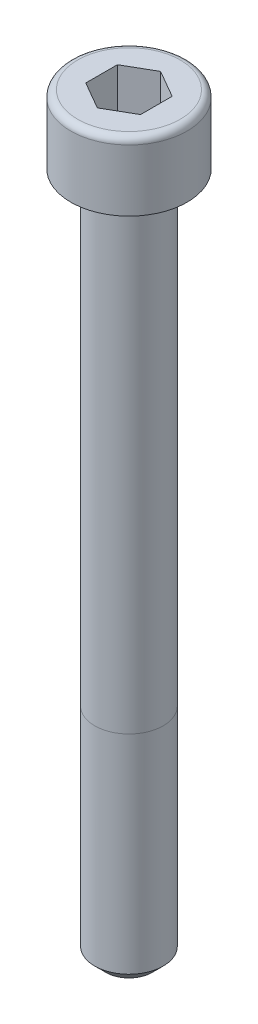
ISO-10303-21;
HEADER;
FILE_DESCRIPTION(('STEP AP214'),'2;1');
FILE_NAME('part.step','',(''),(''),'','','');
FILE_SCHEMA(('AUTOMOTIVE_DESIGN { 1 0 10303 214 1 1 1 1 }'));
ENDSEC;
DATA;
#1=APPLICATION_CONTEXT('core data for automotive mechanical design processes');
#2=APPLICATION_PROTOCOL_DEFINITION('international standard','automotive_design',2000,#1);
#3=PRODUCT_CONTEXT('',#1,'mechanical');
#4=PRODUCT('Part','Part','',(#3));
#5=PRODUCT_RELATED_PRODUCT_CATEGORY('part','',(#4));
#6=PRODUCT_DEFINITION_FORMATION('','',#4);
#7=PRODUCT_DEFINITION_CONTEXT('part definition',#1,'design');
#8=PRODUCT_DEFINITION('design','',#6,#7);
#9=PRODUCT_DEFINITION_SHAPE('','',#8);
#10=(LENGTH_UNIT() NAMED_UNIT(*) SI_UNIT(.MILLI.,.METRE.));
#11=(NAMED_UNIT(*) PLANE_ANGLE_UNIT() SI_UNIT($,.RADIAN.));
#12=(NAMED_UNIT(*) SI_UNIT($,.STERADIAN.) SOLID_ANGLE_UNIT());
#13=UNCERTAINTY_MEASURE_WITH_UNIT(LENGTH_MEASURE(1.E-05),#10,'distance_accuracy_value','');
#14=(GEOMETRIC_REPRESENTATION_CONTEXT(3) GLOBAL_UNCERTAINTY_ASSIGNED_CONTEXT((#13)) GLOBAL_UNIT_ASSIGNED_CONTEXT((#10,
#11,#12)) REPRESENTATION_CONTEXT('',''));
#15=CARTESIAN_POINT('',(0.,0.,0.));
#16=DIRECTION('',(0.,0.,1.));
#17=DIRECTION('',(1.,0.,0.));
#18=AXIS2_PLACEMENT_3D('',#15,#16,#17);
#19=CARTESIAN_POINT('',(0.,65.1172922252011,0.));
#20=DIRECTION('',(0.,1.,0.));
#21=DIRECTION('',(-1.,0.,0.));
#22=AXIS2_PLACEMENT_3D('',#19,#20,#21);
#23=CYLINDRICAL_SURFACE('',#22,2.49999999999999);
#24=CARTESIAN_POINT('',(0.,-54.2,0.));
#25=DIRECTION('',(0.,1.,0.));
#26=DIRECTION('',(-1.,0.,0.));
#27=AXIS2_PLACEMENT_3D('',#24,#25,#26);
#28=CIRCLE('',#27,2.5);
#29=CARTESIAN_POINT('',(-2.49999999999998,-54.2,0.));
#30=VERTEX_POINT('',#29);
#31=EDGE_CURVE('E470',#30,#30,#28,.T.);
#32=ORIENTED_EDGE('',*,*,#31,.T.);
#33=EDGE_LOOP('',(#32));
#34=FACE_BOUND('',#33,.T.);
#35=CARTESIAN_POINT('',(0.,-39.,0.));
#36=DIRECTION('',(0.,1.,0.));
#37=DIRECTION('',(0.,0.,1.));
#38=AXIS2_PLACEMENT_3D('',#35,#36,#37);
#39=CIRCLE('',#38,2.49999999999999);
#40=CARTESIAN_POINT('',(0.,-39.,2.49999999999999));
#41=VERTEX_POINT('',#40);
#42=EDGE_CURVE('E11',#41,#41,#39,.T.);
#43=ORIENTED_EDGE('',*,*,#42,.F.);
#44=EDGE_LOOP('',(#43));
#45=FACE_BOUND('',#44,.T.);
#46=ADVANCED_FACE('F350',(#34,#45),#23,.T.);
#47=CARTESIAN_POINT('',(1.70000000000001,-55.,0.));
#48=DIRECTION('',(0.,-1.,0.));
#49=DIRECTION('',(1.,0.,0.));
#50=AXIS2_PLACEMENT_3D('',#47,#48,#49);
#51=PLANE('',#50);
#52=CARTESIAN_POINT('',(0.,-55.,0.));
#53=DIRECTION('',(0.,1.,0.));
#54=DIRECTION('',(-1.,0.,0.));
#55=AXIS2_PLACEMENT_3D('',#52,#53,#54);
#56=CIRCLE('',#55,1.7);
#57=CARTESIAN_POINT('',(-1.69999999999999,-55.,0.));
#58=VERTEX_POINT('',#57);
#59=EDGE_CURVE('E359',#58,#58,#56,.T.);
#60=ORIENTED_EDGE('',*,*,#59,.F.);
#61=EDGE_LOOP('',(#60));
#62=FACE_BOUND('',#61,.T.);
#63=ADVANCED_FACE('F352',(#62),#51,.T.);
#64=CARTESIAN_POINT('',(0.,-55.,0.));
#65=DIRECTION('',(0.,1.,0.));
#66=DIRECTION('',(-1.,0.,0.));
#67=AXIS2_PLACEMENT_3D('',#64,#65,#66);
#68=CONICAL_SURFACE('',#67,1.7,0.78539816339746);
#69=ORIENTED_EDGE('',*,*,#31,.F.);
#70=EDGE_LOOP('',(#69));
#71=FACE_BOUND('',#70,.T.);
#72=ORIENTED_EDGE('',*,*,#59,.T.);
#73=EDGE_LOOP('',(#72));
#74=FACE_BOUND('',#73,.T.);
#75=ADVANCED_FACE('F475',(#71,#74),#68,.T.);
#76=ORIENTED_EDGE('',*,*,#42,.T.);
#77=EDGE_LOOP('',(#76));
#78=FACE_BOUND('',#77,.T.);
#79=CARTESIAN_POINT('',(0.,-5.,0.));
#80=DIRECTION('',(0.,1.,0.));
#81=DIRECTION('',(-1.,0.,0.));
#82=AXIS2_PLACEMENT_3D('',#79,#80,#81);
#83=CIRCLE('',#82,2.49999999999998);
#84=CARTESIAN_POINT('',(-2.49999999999997,-5.,0.));
#85=VERTEX_POINT('',#84);
#86=EDGE_CURVE('E467',#85,#85,#83,.T.);
#87=ORIENTED_EDGE('',*,*,#86,.F.);
#88=EDGE_LOOP('',(#87));
#89=FACE_BOUND('',#88,.T.);
#90=ADVANCED_FACE('F481',(#78,#89),#23,.T.);
#91=CARTESIAN_POINT('',(2.49999999999999,-5.,0.));
#92=DIRECTION('',(0.,1.,0.));
#93=DIRECTION('',(-1.,0.,0.));
#94=AXIS2_PLACEMENT_3D('',#91,#92,#93);
#95=PLANE('',#94);
#96=CARTESIAN_POINT('',(0.,-5.,0.));
#97=DIRECTION('',(0.,1.,0.));
#98=DIRECTION('',(-1.,0.,0.));
#99=AXIS2_PLACEMENT_3D('',#96,#97,#98);
#100=CIRCLE('',#99,4.24999999999998);
#101=CARTESIAN_POINT('',(-4.24999999999997,-5.00000000000001,0.));
#102=VERTEX_POINT('',#101);
#103=EDGE_CURVE('E464',#102,#102,#100,.T.);
#104=ORIENTED_EDGE('',*,*,#103,.F.);
#105=EDGE_LOOP('',(#104));
#106=FACE_BOUND('',#105,.T.);
#107=ORIENTED_EDGE('',*,*,#86,.T.);
#108=EDGE_LOOP('',(#107));
#109=FACE_BOUND('',#108,.T.);
#110=ADVANCED_FACE('F492',(#106,#109),#95,.F.);
#111=CARTESIAN_POINT('',(0.,65.1172922252011,0.));
#112=DIRECTION('',(0.,1.,0.));
#113=DIRECTION('',(-1.,0.,0.));
#114=AXIS2_PLACEMENT_3D('',#111,#112,#113);
#115=CYLINDRICAL_SURFACE('',#114,4.24999999999998);
#116=CARTESIAN_POINT('',(0.,-0.5,0.));
#117=DIRECTION('',(0.,1.,0.));
#118=DIRECTION('',(-1.,0.,0.));
#119=AXIS2_PLACEMENT_3D('',#116,#117,#118);
#120=CIRCLE('',#119,4.24999999999998);
#121=CARTESIAN_POINT('',(-4.24999999999998,-0.500000000000001,0.));
#122=VERTEX_POINT('',#121);
#123=EDGE_CURVE('E461',#122,#122,#120,.T.);
#124=ORIENTED_EDGE('',*,*,#123,.F.);
#125=EDGE_LOOP('',(#124));
#126=FACE_BOUND('',#125,.T.);
#127=ORIENTED_EDGE('',*,*,#103,.T.);
#128=EDGE_LOOP('',(#127));
#129=FACE_BOUND('',#128,.T.);
#130=ADVANCED_FACE('F497',(#126,#129),#115,.T.);
#131=CARTESIAN_POINT('',(0.,-0.5,0.));
#132=DIRECTION('',(0.,1.,0.));
#133=DIRECTION('',(-1.,0.,0.));
#134=AXIS2_PLACEMENT_3D('',#131,#132,#133);
#135=TOROIDAL_SURFACE('',#134,3.74999999999998,0.5);
#136=CARTESIAN_POINT('',(0.,0.,0.));
#137=DIRECTION('',(0.,1.,0.));
#138=DIRECTION('',(-1.,0.,0.));
#139=AXIS2_PLACEMENT_3D('',#136,#137,#138);
#140=CIRCLE('',#139,3.74999999999998);
#141=CARTESIAN_POINT('',(-3.74999999999998,0.,0.));
#142=VERTEX_POINT('',#141);
#143=EDGE_CURVE('E452',#142,#142,#140,.T.);
#144=ORIENTED_EDGE('',*,*,#143,.F.);
#145=EDGE_LOOP('',(#144));
#146=FACE_BOUND('',#145,.T.);
#147=ORIENTED_EDGE('',*,*,#123,.T.);
#148=EDGE_LOOP('',(#147));
#149=FACE_BOUND('',#148,.T.);
#150=ADVANCED_FACE('F506',(#146,#149),#135,.T.);
#151=CARTESIAN_POINT('',(3.74999999999999,0.,0.));
#152=DIRECTION('',(0.,-1.,0.));
#153=DIRECTION('',(1.,0.,0.));
#154=AXIS2_PLACEMENT_3D('',#151,#152,#153);
#155=PLANE('',#154);
#156=DIRECTION('',(0.,0.,1.));
#157=VECTOR('',#156,1.);
#158=CARTESIAN_POINT('',(-2.,0.,-1.15470053837925));
#159=LINE('',#158,#157);
#160=CARTESIAN_POINT('',(-2.,0.,-1.15470053837925));
#161=VERTEX_POINT('',#160);
#162=CARTESIAN_POINT('',(-2.,0.,1.15470053837925));
#163=VERTEX_POINT('',#162);
#164=EDGE_CURVE('E429',#161,#163,#159,.T.);
#165=ORIENTED_EDGE('',*,*,#164,.F.);
#166=DIRECTION('',(-0.866025403784439,0.,0.5));
#167=VECTOR('',#166,1.);
#168=CARTESIAN_POINT('',(0.,0.,-2.3094010767585));
#169=LINE('',#168,#167);
#170=CARTESIAN_POINT('',(0.,0.,-2.3094010767585));
#171=VERTEX_POINT('',#170);
#172=EDGE_CURVE('E366',#171,#161,#169,.T.);
#173=ORIENTED_EDGE('',*,*,#172,.F.);
#174=DIRECTION('',(0.866025403784439,0.,0.5));
#175=VECTOR('',#174,1.);
#176=CARTESIAN_POINT('',(0.,0.,-2.3094010767585));
#177=LINE('',#176,#175);
#178=CARTESIAN_POINT('',(2.,0.,-1.15470053837925));
#179=VERTEX_POINT('',#178);
#180=EDGE_CURVE('E580',#171,#179,#177,.T.);
#181=ORIENTED_EDGE('',*,*,#180,.T.);
#182=DIRECTION('',(0.,0.,1.));
#183=VECTOR('',#182,1.);
#184=CARTESIAN_POINT('',(2.,0.,-1.15470053837925));
#185=LINE('',#184,#183);
#186=CARTESIAN_POINT('',(2.,0.,1.15470053837925));
#187=VERTEX_POINT('',#186);
#188=EDGE_CURVE('E577',#179,#187,#185,.T.);
#189=ORIENTED_EDGE('',*,*,#188,.T.);
#190=DIRECTION('',(-0.866025403784439,0.,0.5));
#191=VECTOR('',#190,1.);
#192=CARTESIAN_POINT('',(2.,0.,1.15470053837925));
#193=LINE('',#192,#191);
#194=CARTESIAN_POINT('',(0.,0.,2.3094010767585));
#195=VERTEX_POINT('',#194);
#196=EDGE_CURVE('E574',#187,#195,#193,.T.);
#197=ORIENTED_EDGE('',*,*,#196,.T.);
#198=DIRECTION('',(0.866025403784439,0.,0.5));
#199=VECTOR('',#198,1.);
#200=CARTESIAN_POINT('',(-2.,0.,1.15470053837925));
#201=LINE('',#200,#199);
#202=EDGE_CURVE('E572',#163,#195,#201,.T.);
#203=ORIENTED_EDGE('',*,*,#202,.F.);
#204=EDGE_LOOP('',(#165,#173,#181,#189,#197,#203));
#205=FACE_BOUND('',#204,.T.);
#206=ORIENTED_EDGE('',*,*,#143,.T.);
#207=EDGE_LOOP('',(#206));
#208=FACE_BOUND('',#207,.T.);
#209=ADVANCED_FACE('F513',(#205,#208),#155,.F.);
#210=CARTESIAN_POINT('',(0.,-3.6,-2.3094010767585));
#211=DIRECTION('',(-0.5,0.,-0.866025403784439));
#212=DIRECTION('',(-0.866025403784439,0.,0.5));
#213=AXIS2_PLACEMENT_3D('',#210,#211,#212);
#214=PLANE('',#213);
#215=ORIENTED_EDGE('',*,*,#172,.T.);
#216=DIRECTION('',(0.,1.,0.));
#217=VECTOR('',#216,1.);
#218=CARTESIAN_POINT('',(-2.,-3.6,-1.15470053837925));
#219=LINE('',#218,#217);
#220=CARTESIAN_POINT('',(-2.,-3.6,-1.15470053837925));
#221=VERTEX_POINT('',#220);
#222=EDGE_CURVE('E434',#221,#161,#219,.T.);
#223=ORIENTED_EDGE('',*,*,#222,.F.);
#224=DIRECTION('',(-0.866025403784439,0.,0.5));
#225=VECTOR('',#224,1.);
#226=CARTESIAN_POINT('',(0.,-3.6,-2.3094010767585));
#227=LINE('',#226,#225);
#228=CARTESIAN_POINT('',(0.,-3.6,-2.3094010767585));
#229=VERTEX_POINT('',#228);
#230=EDGE_CURVE('E423',#229,#221,#227,.T.);
#231=ORIENTED_EDGE('',*,*,#230,.F.);
#232=DIRECTION('',(0.,1.,0.));
#233=VECTOR('',#232,1.);
#234=CARTESIAN_POINT('',(0.,-3.6,-2.3094010767585));
#235=LINE('',#234,#233);
#236=EDGE_CURVE('E450',#229,#171,#235,.T.);
#237=ORIENTED_EDGE('',*,*,#236,.T.);
#238=EDGE_LOOP('',(#215,#223,#231,#237));
#239=FACE_BOUND('',#238,.T.);
#240=ADVANCED_FACE('F517',(#239),#214,.F.);
#241=CARTESIAN_POINT('',(0.,-3.6,-2.3094010767585));
#242=DIRECTION('',(-0.5,0.,0.866025403784439));
#243=DIRECTION('',(0.866025403784439,0.,0.5));
#244=AXIS2_PLACEMENT_3D('',#241,#242,#243);
#245=PLANE('',#244);
#246=ORIENTED_EDGE('',*,*,#180,.F.);
#247=ORIENTED_EDGE('',*,*,#236,.F.);
#248=DIRECTION('',(0.866025403784439,0.,0.5));
#249=VECTOR('',#248,1.);
#250=CARTESIAN_POINT('',(0.,-3.6,-2.3094010767585));
#251=LINE('',#250,#249);
#252=CARTESIAN_POINT('',(2.,-3.6,-1.15470053837925));
#253=VERTEX_POINT('',#252);
#254=EDGE_CURVE('E447',#229,#253,#251,.T.);
#255=ORIENTED_EDGE('',*,*,#254,.T.);
#256=DIRECTION('',(0.,1.,0.));
#257=VECTOR('',#256,1.);
#258=CARTESIAN_POINT('',(2.,-3.6,-1.15470053837925));
#259=LINE('',#258,#257);
#260=EDGE_CURVE('E453',#253,#179,#259,.T.);
#261=ORIENTED_EDGE('',*,*,#260,.T.);
#262=EDGE_LOOP('',(#246,#247,#255,#261));
#263=FACE_BOUND('',#262,.T.);
#264=ADVANCED_FACE('F521',(#263),#245,.T.);
#265=CARTESIAN_POINT('',(2.,-3.6,-1.15470053837925));
#266=DIRECTION('',(-1.,0.,0.));
#267=DIRECTION('',(0.,-1.,0.));
#268=AXIS2_PLACEMENT_3D('',#265,#266,#267);
#269=PLANE('',#268);
#270=ORIENTED_EDGE('',*,*,#188,.F.);
#271=ORIENTED_EDGE('',*,*,#260,.F.);
#272=DIRECTION('',(0.,0.,1.));
#273=VECTOR('',#272,1.);
#274=CARTESIAN_POINT('',(2.,-3.6,-1.15470053837925));
#275=LINE('',#274,#273);
#276=CARTESIAN_POINT('',(2.,-3.6,1.15470053837925));
#277=VERTEX_POINT('',#276);
#278=EDGE_CURVE('E441',#253,#277,#275,.T.);
#279=ORIENTED_EDGE('',*,*,#278,.T.);
#280=DIRECTION('',(0.,1.,0.));
#281=VECTOR('',#280,1.);
#282=CARTESIAN_POINT('',(2.,-3.6,1.15470053837925));
#283=LINE('',#282,#281);
#284=EDGE_CURVE('E455',#277,#187,#283,.T.);
#285=ORIENTED_EDGE('',*,*,#284,.T.);
#286=EDGE_LOOP('',(#270,#271,#279,#285));
#287=FACE_BOUND('',#286,.T.);
#288=ADVANCED_FACE('F531',(#287),#269,.T.);
#289=CARTESIAN_POINT('',(2.,-3.6,1.15470053837925));
#290=DIRECTION('',(-0.5,0.,-0.866025403784438));
#291=DIRECTION('',(-0.866025403784439,0.,0.5));
#292=AXIS2_PLACEMENT_3D('',#289,#290,#291);
#293=PLANE('',#292);
#294=ORIENTED_EDGE('',*,*,#196,.F.);
#295=ORIENTED_EDGE('',*,*,#284,.F.);
#296=DIRECTION('',(-0.866025403784439,0.,0.5));
#297=VECTOR('',#296,1.);
#298=CARTESIAN_POINT('',(2.,-3.6,1.15470053837925));
#299=LINE('',#298,#297);
#300=CARTESIAN_POINT('',(0.,-3.6,2.3094010767585));
#301=VERTEX_POINT('',#300);
#302=EDGE_CURVE('E438',#277,#301,#299,.T.);
#303=ORIENTED_EDGE('',*,*,#302,.T.);
#304=DIRECTION('',(0.,1.,0.));
#305=VECTOR('',#304,1.);
#306=CARTESIAN_POINT('',(0.,-3.6,2.3094010767585));
#307=LINE('',#306,#305);
#308=EDGE_CURVE('E433',#301,#195,#307,.T.);
#309=ORIENTED_EDGE('',*,*,#308,.T.);
#310=EDGE_LOOP('',(#294,#295,#303,#309));
#311=FACE_BOUND('',#310,.T.);
#312=ADVANCED_FACE('F528',(#311),#293,.T.);
#313=CARTESIAN_POINT('',(-2.,-3.6,1.15470053837925));
#314=DIRECTION('',(-0.5,0.,0.866025403784438));
#315=DIRECTION('',(0.866025403784439,0.,0.5));
#316=AXIS2_PLACEMENT_3D('',#313,#314,#315);
#317=PLANE('',#316);
#318=ORIENTED_EDGE('',*,*,#202,.T.);
#319=ORIENTED_EDGE('',*,*,#308,.F.);
#320=DIRECTION('',(0.866025403784439,0.,0.5));
#321=VECTOR('',#320,1.);
#322=CARTESIAN_POINT('',(-2.,-3.6,1.15470053837925));
#323=LINE('',#322,#321);
#324=CARTESIAN_POINT('',(-2.,-3.6,1.15470053837925));
#325=VERTEX_POINT('',#324);
#326=EDGE_CURVE('E374',#325,#301,#323,.T.);
#327=ORIENTED_EDGE('',*,*,#326,.F.);
#328=DIRECTION('',(0.,1.,0.));
#329=VECTOR('',#328,1.);
#330=CARTESIAN_POINT('',(-2.,-3.6,1.15470053837925));
#331=LINE('',#330,#329);
#332=EDGE_CURVE('E426',#325,#163,#331,.T.);
#333=ORIENTED_EDGE('',*,*,#332,.T.);
#334=EDGE_LOOP('',(#318,#319,#327,#333));
#335=FACE_BOUND('',#334,.T.);
#336=ADVANCED_FACE('F437',(#335),#317,.F.);
#337=CARTESIAN_POINT('',(-2.,-3.6,-1.15470053837925));
#338=DIRECTION('',(-1.,0.,0.));
#339=DIRECTION('',(0.,-1.,0.));
#340=AXIS2_PLACEMENT_3D('',#337,#338,#339);
#341=PLANE('',#340);
#342=ORIENTED_EDGE('',*,*,#164,.T.);
#343=ORIENTED_EDGE('',*,*,#332,.F.);
#344=DIRECTION('',(0.,0.,1.));
#345=VECTOR('',#344,1.);
#346=CARTESIAN_POINT('',(-2.,-3.6,-1.15470053837925));
#347=LINE('',#346,#345);
#348=EDGE_CURVE('E416',#221,#325,#347,.T.);
#349=ORIENTED_EDGE('',*,*,#348,.F.);
#350=ORIENTED_EDGE('',*,*,#222,.T.);
#351=EDGE_LOOP('',(#342,#343,#349,#350));
#352=FACE_BOUND('',#351,.T.);
#353=ADVANCED_FACE('F427',(#352),#341,.F.);
#354=CARTESIAN_POINT('',(-2.,-3.6,-1.15470053837925));
#355=DIRECTION('',(0.0980580675690918,0.98058067569092,0.169841555121689));
#356=DIRECTION('',(0.,-0.170664037196572,0.985329278164293));
#357=AXIS2_PLACEMENT_3D('',#354,#355,#356);
#358=PLANE('',#357);
#359=DIRECTION('',(-0.853320185982861,0.170664037196572,-0.492664639082147));
#360=VECTOR('',#359,1.);
#361=CARTESIAN_POINT('',(0.,-4.,0.));
#362=LINE('',#361,#360);
#363=CARTESIAN_POINT('',(0.,-4.,0.));
#364=VERTEX_POINT('',#363);
#365=EDGE_CURVE('E420',#364,#221,#362,.T.);
#366=ORIENTED_EDGE('',*,*,#365,.F.);
#367=DIRECTION('',(0.,0.170664037196572,-0.985329278164293));
#368=VECTOR('',#367,1.);
#369=CARTESIAN_POINT('',(0.,-4.,0.));
#370=LINE('',#369,#368);
#371=EDGE_CURVE('E561',#364,#229,#370,.T.);
#372=ORIENTED_EDGE('',*,*,#371,.T.);
#373=ORIENTED_EDGE('',*,*,#230,.T.);
#374=EDGE_LOOP('',(#366,#372,#373));
#375=FACE_BOUND('',#374,.T.);
#376=ADVANCED_FACE('F524',(#375),#358,.T.);
#377=CARTESIAN_POINT('',(0.,-3.6,-2.3094010767585));
#378=DIRECTION('',(-0.0980580675690922,0.98058067569092,0.169841555121689));
#379=DIRECTION('',(0.,-0.170664037196572,0.985329278164293));
#380=AXIS2_PLACEMENT_3D('',#377,#378,#379);
#381=PLANE('',#380);
#382=ORIENTED_EDGE('',*,*,#371,.F.);
#383=DIRECTION('',(0.853320185982861,0.170664037196573,-0.492664639082147));
#384=VECTOR('',#383,1.);
#385=CARTESIAN_POINT('',(0.,-4.,0.));
#386=LINE('',#385,#384);
#387=EDGE_CURVE('E412',#364,#253,#386,.T.);
#388=ORIENTED_EDGE('',*,*,#387,.T.);
#389=ORIENTED_EDGE('',*,*,#254,.F.);
#390=EDGE_LOOP('',(#382,#388,#389));
#391=FACE_BOUND('',#390,.T.);
#392=ADVANCED_FACE('F541',(#391),#381,.T.);
#393=CARTESIAN_POINT('',(-2.,-3.6,1.15470053837925));
#394=DIRECTION('',(0.196116135138184,0.98058067569092,0.));
#395=DIRECTION('',(-0.98058067569092,0.196116135138184,0.));
#396=AXIS2_PLACEMENT_3D('',#393,#394,#395);
#397=PLANE('',#396);
#398=DIRECTION('',(-0.853320185982861,0.170664037196572,0.492664639082146));
#399=VECTOR('',#398,1.);
#400=CARTESIAN_POINT('',(0.,-4.,0.));
#401=LINE('',#400,#399);
#402=EDGE_CURVE('E406',#364,#325,#401,.T.);
#403=ORIENTED_EDGE('',*,*,#402,.F.);
#404=ORIENTED_EDGE('',*,*,#365,.T.);
#405=ORIENTED_EDGE('',*,*,#348,.T.);
#406=EDGE_LOOP('',(#403,#404,#405));
#407=FACE_BOUND('',#406,.T.);
#408=ADVANCED_FACE('F418',(#407),#397,.T.);
#409=CARTESIAN_POINT('',(2.,-3.6,-1.15470053837925));
#410=DIRECTION('',(-0.196116135138184,0.98058067569092,0.));
#411=DIRECTION('',(-0.98058067569092,-0.196116135138184,0.));
#412=AXIS2_PLACEMENT_3D('',#409,#410,#411);
#413=PLANE('',#412);
#414=ORIENTED_EDGE('',*,*,#387,.F.);
#415=DIRECTION('',(0.853320185982861,0.170664037196573,0.492664639082146));
#416=VECTOR('',#415,1.);
#417=CARTESIAN_POINT('',(0.,-4.,0.));
#418=LINE('',#417,#416);
#419=EDGE_CURVE('E413',#364,#277,#418,.T.);
#420=ORIENTED_EDGE('',*,*,#419,.T.);
#421=ORIENTED_EDGE('',*,*,#278,.F.);
#422=EDGE_LOOP('',(#414,#420,#421));
#423=FACE_BOUND('',#422,.T.);
#424=ADVANCED_FACE('F548',(#423),#413,.T.);
#425=CARTESIAN_POINT('',(0.,-3.6,2.3094010767585));
#426=DIRECTION('',(0.0980580675690919,0.98058067569092,-0.169841555121689));
#427=DIRECTION('',(0.,0.170664037196572,0.985329278164293));
#428=AXIS2_PLACEMENT_3D('',#425,#426,#427);
#429=PLANE('',#428);
#430=DIRECTION('',(0.,0.170664037196572,0.985329278164293));
#431=VECTOR('',#430,1.);
#432=CARTESIAN_POINT('',(0.,-4.,0.));
#433=LINE('',#432,#431);
#434=EDGE_CURVE('E409',#364,#301,#433,.T.);
#435=ORIENTED_EDGE('',*,*,#434,.F.);
#436=ORIENTED_EDGE('',*,*,#402,.T.);
#437=ORIENTED_EDGE('',*,*,#326,.T.);
#438=EDGE_LOOP('',(#435,#436,#437));
#439=FACE_BOUND('',#438,.T.);
#440=ADVANCED_FACE('F408',(#439),#429,.T.);
#441=CARTESIAN_POINT('',(2.,-3.6,1.15470053837925));
#442=DIRECTION('',(-0.0980580675690923,0.98058067569092,-0.169841555121689));
#443=DIRECTION('',(0.,0.170664037196572,0.985329278164293));
#444=AXIS2_PLACEMENT_3D('',#441,#442,#443);
#445=PLANE('',#444);
#446=ORIENTED_EDGE('',*,*,#419,.F.);
#447=ORIENTED_EDGE('',*,*,#434,.T.);
#448=ORIENTED_EDGE('',*,*,#302,.F.);
#449=EDGE_LOOP('',(#446,#447,#448));
#450=FACE_BOUND('',#449,.T.);
#451=ADVANCED_FACE('F525',(#450),#445,.T.);
#452=CLOSED_SHELL('',(#46,#63,#75,#90,#110,#130,#150,#209,#240,#264,#288,#312,#336,#353,#376,
#392,#408,#424,#440,#451));
#453=MANIFOLD_SOLID_BREP('B2',#452);
#454=ADVANCED_BREP_SHAPE_REPRESENTATION('',(#18,#453),#14);
#455=SHAPE_DEFINITION_REPRESENTATION(#9,#454);
ENDSEC;
END-ISO-10303-21;
